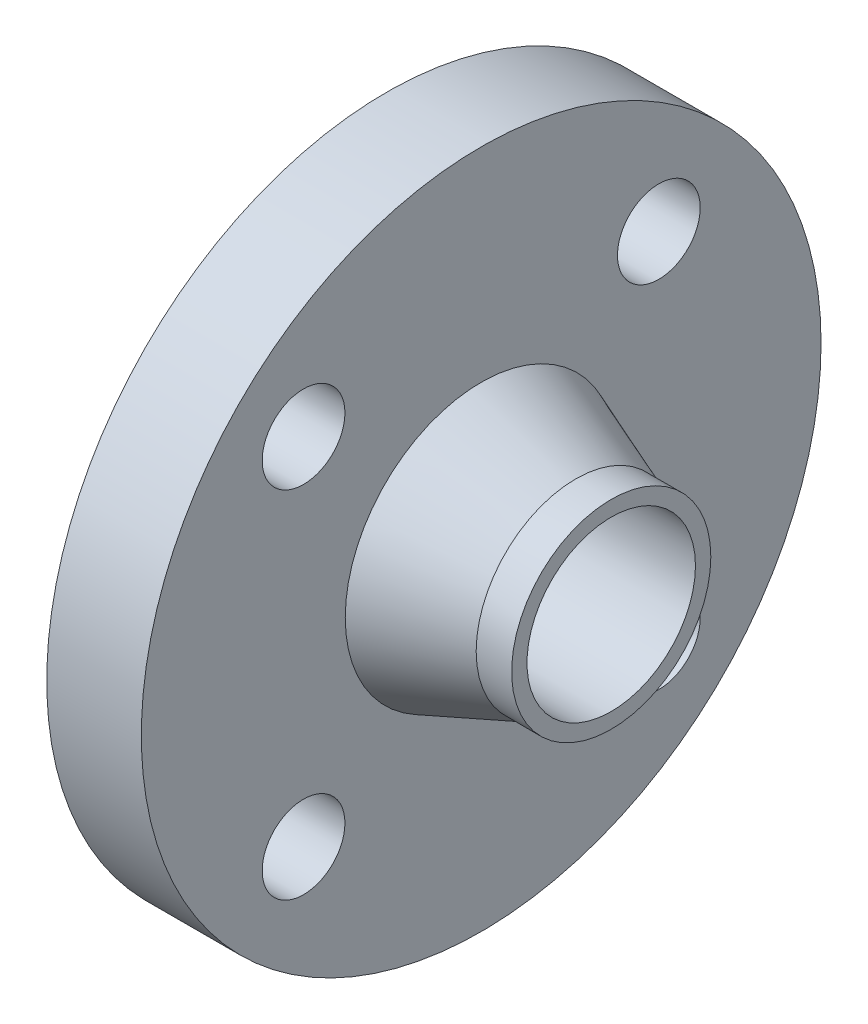
ISO-10303-21;
HEADER;
FILE_DESCRIPTION(('STEP AP214'),'2;1');
FILE_NAME('part.step','',(''),(''),'','','');
FILE_SCHEMA(('AUTOMOTIVE_DESIGN { 1 0 10303 214 1 1 1 1 }'));
ENDSEC;
DATA;
#1=APPLICATION_CONTEXT('core data for automotive mechanical design processes');
#2=APPLICATION_PROTOCOL_DEFINITION('international standard','automotive_design',2000,#1);
#3=PRODUCT_CONTEXT('',#1,'mechanical');
#4=PRODUCT('Part','Part','',(#3));
#5=PRODUCT_RELATED_PRODUCT_CATEGORY('part','',(#4));
#6=PRODUCT_DEFINITION_FORMATION('','',#4);
#7=PRODUCT_DEFINITION_CONTEXT('part definition',#1,'design');
#8=PRODUCT_DEFINITION('design','',#6,#7);
#9=PRODUCT_DEFINITION_SHAPE('','',#8);
#10=(LENGTH_UNIT() NAMED_UNIT(*) SI_UNIT(.MILLI.,.METRE.));
#11=(NAMED_UNIT(*) PLANE_ANGLE_UNIT() SI_UNIT($,.RADIAN.));
#12=(NAMED_UNIT(*) SI_UNIT($,.STERADIAN.) SOLID_ANGLE_UNIT());
#13=UNCERTAINTY_MEASURE_WITH_UNIT(LENGTH_MEASURE(1.E-05),#10,'distance_accuracy_value','');
#14=(GEOMETRIC_REPRESENTATION_CONTEXT(3) GLOBAL_UNCERTAINTY_ASSIGNED_CONTEXT((#13)) GLOBAL_UNIT_ASSIGNED_CONTEXT((#10,
#11,#12)) REPRESENTATION_CONTEXT('',''));
#15=CARTESIAN_POINT('',(0.,0.,0.));
#16=DIRECTION('',(0.,0.,1.));
#17=DIRECTION('',(1.,0.,0.));
#18=AXIS2_PLACEMENT_3D('',#15,#16,#17);
#19=CARTESIAN_POINT('',(0.,24.125,0.));
#20=DIRECTION('',(-1.,0.,0.));
#21=DIRECTION('',(0.,0.,1.));
#22=AXIS2_PLACEMENT_3D('',#19,#20,#21);
#23=PLANE('',#22);
#24=CARTESIAN_POINT('',(0.,0.,0.));
#25=DIRECTION('',(1.,0.,0.));
#26=DIRECTION('',(0.,0.,-1.));
#27=AXIS2_PLACEMENT_3D('',#24,#25,#26);
#28=CIRCLE('',#27,14.25);
#29=CARTESIAN_POINT('',(0.,0.,-14.25));
#30=VERTEX_POINT('',#29);
#31=EDGE_CURVE('E17',#30,#30,#28,.T.);
#32=ORIENTED_EDGE('',*,*,#31,.T.);
#33=EDGE_LOOP('',(#32));
#34=FACE_BOUND('',#33,.T.);
#35=CARTESIAN_POINT('',(0.,0.,0.));
#36=DIRECTION('',(1.,0.,0.));
#37=DIRECTION('',(0.,0.,-1.));
#38=AXIS2_PLACEMENT_3D('',#35,#36,#37);
#39=CIRCLE('',#38,34.);
#40=CARTESIAN_POINT('',(0.,0.,-34.));
#41=VERTEX_POINT('',#40);
#42=EDGE_CURVE('E67',#41,#41,#39,.T.);
#43=ORIENTED_EDGE('',*,*,#42,.F.);
#44=EDGE_LOOP('',(#43));
#45=FACE_BOUND('',#44,.T.);
#46=ADVANCED_FACE('F14',(#34,#45),#23,.T.);
#47=CARTESIAN_POINT('',(20.,0.,0.));
#48=DIRECTION('',(1.,0.,0.));
#49=DIRECTION('',(0.,0.,-1.));
#50=AXIS2_PLACEMENT_3D('',#47,#48,#49);
#51=CYLINDRICAL_SURFACE('',#50,14.25);
#52=CARTESIAN_POINT('',(40.,0.,0.));
#53=DIRECTION('',(1.,0.,0.));
#54=DIRECTION('',(0.,0.,-1.));
#55=AXIS2_PLACEMENT_3D('',#52,#53,#54);
#56=CIRCLE('',#55,14.25);
#57=CARTESIAN_POINT('',(40.,0.,-14.25));
#58=VERTEX_POINT('',#57);
#59=EDGE_CURVE('E65',#58,#58,#56,.F.);
#60=ORIENTED_EDGE('',*,*,#59,.F.);
#61=EDGE_LOOP('',(#60));
#62=FACE_BOUND('',#61,.T.);
#63=ORIENTED_EDGE('',*,*,#31,.F.);
#64=EDGE_LOOP('',(#63));
#65=FACE_BOUND('',#64,.T.);
#66=ADVANCED_FACE('F76',(#62,#65),#51,.F.);
#67=CARTESIAN_POINT('',(0.999999999999992,0.,0.));
#68=DIRECTION('',(1.,0.,0.));
#69=DIRECTION('',(0.,0.,-1.));
#70=AXIS2_PLACEMENT_3D('',#67,#68,#69);
#71=CYLINDRICAL_SURFACE('',#70,34.);
#72=ORIENTED_EDGE('',*,*,#42,.T.);
#73=EDGE_LOOP('',(#72));
#74=FACE_BOUND('',#73,.T.);
#75=CARTESIAN_POINT('',(1.99999999999999,0.,0.));
#76=DIRECTION('',(1.,0.,0.));
#77=DIRECTION('',(0.,0.,-1.));
#78=AXIS2_PLACEMENT_3D('',#75,#76,#77);
#79=CIRCLE('',#78,34.);
#80=CARTESIAN_POINT('',(1.99999999999999,0.,-34.));
#81=VERTEX_POINT('',#80);
#82=EDGE_CURVE('E62',#81,#81,#79,.T.);
#83=ORIENTED_EDGE('',*,*,#82,.F.);
#84=EDGE_LOOP('',(#83));
#85=FACE_BOUND('',#84,.T.);
#86=ADVANCED_FACE('F78',(#74,#85),#71,.T.);
#87=CARTESIAN_POINT('',(40.,15.55,0.));
#88=DIRECTION('',(1.,0.,0.));
#89=DIRECTION('',(0.,0.,-1.));
#90=AXIS2_PLACEMENT_3D('',#87,#88,#89);
#91=PLANE('',#90);
#92=ORIENTED_EDGE('',*,*,#59,.T.);
#93=EDGE_LOOP('',(#92));
#94=FACE_BOUND('',#93,.T.);
#95=CARTESIAN_POINT('',(40.,0.,0.));
#96=DIRECTION('',(1.,0.,0.));
#97=DIRECTION('',(0.,0.,-1.));
#98=AXIS2_PLACEMENT_3D('',#95,#96,#97);
#99=CIRCLE('',#98,16.85);
#100=CARTESIAN_POINT('',(40.,0.,-16.85));
#101=VERTEX_POINT('',#100);
#102=EDGE_CURVE('E59',#101,#101,#99,.F.);
#103=ORIENTED_EDGE('',*,*,#102,.F.);
#104=EDGE_LOOP('',(#103));
#105=FACE_BOUND('',#104,.T.);
#106=ADVANCED_FACE('F85',(#94,#105),#91,.T.);
#107=CARTESIAN_POINT('',(1.99999999999999,45.75,0.));
#108=DIRECTION('',(-1.,0.,0.));
#109=DIRECTION('',(0.,0.,1.));
#110=AXIS2_PLACEMENT_3D('',#107,#108,#109);
#111=PLANE('',#110);
#112=ORIENTED_EDGE('',*,*,#82,.T.);
#113=EDGE_LOOP('',(#112));
#114=FACE_BOUND('',#113,.T.);
#115=CARTESIAN_POINT('',(1.99999999999999,30.0520382004283,30.0520382004283));
#116=DIRECTION('',(1.,0.,0.));
#117=DIRECTION('',(0.,0.,-1.));
#118=AXIS2_PLACEMENT_3D('',#115,#116,#117);
#119=CIRCLE('',#118,7.);
#120=CARTESIAN_POINT('',(1.99999999999999,30.0520382004283,23.0520382004283));
#121=VERTEX_POINT('',#120);
#122=EDGE_CURVE('E44',#121,#121,#119,.T.);
#123=ORIENTED_EDGE('',*,*,#122,.T.);
#124=EDGE_LOOP('',(#123));
#125=FACE_BOUND('',#124,.T.);
#126=CARTESIAN_POINT('',(1.99999999999999,-30.0520382004283,30.0520382004283));
#127=DIRECTION('',(1.,0.,0.));
#128=DIRECTION('',(0.,0.,-1.));
#129=AXIS2_PLACEMENT_3D('',#126,#127,#128);
#130=CIRCLE('',#129,7.);
#131=CARTESIAN_POINT('',(1.99999999999999,-30.0520382004283,23.0520382004283));
#132=VERTEX_POINT('',#131);
#133=EDGE_CURVE('E47',#132,#132,#130,.T.);
#134=ORIENTED_EDGE('',*,*,#133,.T.);
#135=EDGE_LOOP('',(#134));
#136=FACE_BOUND('',#135,.T.);
#137=CARTESIAN_POINT('',(1.99999999999999,-30.0520382004283,-30.0520382004283));
#138=DIRECTION('',(1.,0.,0.));
#139=DIRECTION('',(0.,0.,-1.));
#140=AXIS2_PLACEMENT_3D('',#137,#138,#139);
#141=CIRCLE('',#140,7.);
#142=CARTESIAN_POINT('',(1.99999999999999,-30.0520382004283,-37.0520382004283));
#143=VERTEX_POINT('',#142);
#144=EDGE_CURVE('E50',#143,#143,#141,.T.);
#145=ORIENTED_EDGE('',*,*,#144,.T.);
#146=EDGE_LOOP('',(#145));
#147=FACE_BOUND('',#146,.T.);
#148=CARTESIAN_POINT('',(1.99999999999999,30.0520382004283,-30.0520382004283));
#149=DIRECTION('',(1.,0.,0.));
#150=DIRECTION('',(0.,0.,-1.));
#151=AXIS2_PLACEMENT_3D('',#148,#149,#150);
#152=CIRCLE('',#151,7.);
#153=CARTESIAN_POINT('',(1.99999999999999,30.0520382004283,-37.0520382004283));
#154=VERTEX_POINT('',#153);
#155=EDGE_CURVE('E53',#154,#154,#152,.T.);
#156=ORIENTED_EDGE('',*,*,#155,.T.);
#157=EDGE_LOOP('',(#156));
#158=FACE_BOUND('',#157,.T.);
#159=CARTESIAN_POINT('',(1.99999999999998,0.,0.));
#160=DIRECTION('',(1.,0.,0.));
#161=DIRECTION('',(0.,0.,-1.));
#162=AXIS2_PLACEMENT_3D('',#159,#160,#161);
#163=CIRCLE('',#162,57.5);
#164=CARTESIAN_POINT('',(1.99999999999998,0.,-57.5));
#165=VERTEX_POINT('',#164);
#166=EDGE_CURVE('E56',#165,#165,#163,.T.);
#167=ORIENTED_EDGE('',*,*,#166,.F.);
#168=EDGE_LOOP('',(#167));
#169=FACE_BOUND('',#168,.T.);
#170=ADVANCED_FACE('F122',(#114,#125,#136,#147,#158,#169),#111,.T.);
#171=CARTESIAN_POINT('',(37.,0.,0.));
#172=DIRECTION('',(1.,0.,0.));
#173=DIRECTION('',(0.,0.,-1.));
#174=AXIS2_PLACEMENT_3D('',#171,#172,#173);
#175=CYLINDRICAL_SURFACE('',#174,16.85);
#176=CARTESIAN_POINT('',(34.0000000012894,0.,0.));
#177=DIRECTION('',(-1.,0.,0.));
#178=DIRECTION('',(0.,1.,0.));
#179=AXIS2_PLACEMENT_3D('',#176,#177,#178);
#180=CIRCLE('',#179,16.8500000033545);
#181=CARTESIAN_POINT('',(34.0000000012894,16.8500000033545,0.));
#182=VERTEX_POINT('',#181);
#183=EDGE_CURVE('E43',#182,#182,#180,.T.);
#184=ORIENTED_EDGE('',*,*,#183,.F.);
#185=EDGE_LOOP('',(#184));
#186=FACE_BOUND('',#185,.T.);
#187=ORIENTED_EDGE('',*,*,#102,.T.);
#188=EDGE_LOOP('',(#187));
#189=FACE_BOUND('',#188,.T.);
#190=ADVANCED_FACE('F118',(#186,#189),#175,.T.);
#191=CARTESIAN_POINT('',(9.99999999999998,0.,0.));
#192=DIRECTION('',(1.,0.,0.));
#193=DIRECTION('',(0.,0.,-1.));
#194=AXIS2_PLACEMENT_3D('',#191,#192,#193);
#195=CYLINDRICAL_SURFACE('',#194,57.5);
#196=ORIENTED_EDGE('',*,*,#166,.T.);
#197=EDGE_LOOP('',(#196));
#198=FACE_BOUND('',#197,.T.);
#199=CARTESIAN_POINT('',(18.,0.,0.));
#200=DIRECTION('',(1.,0.,0.));
#201=DIRECTION('',(0.,0.,-1.));
#202=AXIS2_PLACEMENT_3D('',#199,#200,#201);
#203=CIRCLE('',#202,57.5);
#204=CARTESIAN_POINT('',(18.,0.,-57.5));
#205=VERTEX_POINT('',#204);
#206=EDGE_CURVE('E40',#205,#205,#203,.T.);
#207=ORIENTED_EDGE('',*,*,#206,.F.);
#208=EDGE_LOOP('',(#207));
#209=FACE_BOUND('',#208,.T.);
#210=ADVANCED_FACE('F114',(#198,#209),#195,.T.);
#211=CARTESIAN_POINT('',(1.99999999999999,30.0520382004283,-30.0520382004283));
#212=DIRECTION('',(1.,0.,0.));
#213=DIRECTION('',(0.,0.,-1.));
#214=AXIS2_PLACEMENT_3D('',#211,#212,#213);
#215=CYLINDRICAL_SURFACE('',#214,7.);
#216=ORIENTED_EDGE('',*,*,#155,.F.);
#217=EDGE_LOOP('',(#216));
#218=FACE_BOUND('',#217,.T.);
#219=CARTESIAN_POINT('',(18.,30.0520382004283,-30.0520382004283));
#220=DIRECTION('',(1.,0.,0.));
#221=DIRECTION('',(0.,0.,-1.));
#222=AXIS2_PLACEMENT_3D('',#219,#220,#221);
#223=CIRCLE('',#222,7.);
#224=CARTESIAN_POINT('',(18.,30.0520382004283,-37.0520382004283));
#225=VERTEX_POINT('',#224);
#226=EDGE_CURVE('E37',#225,#225,#223,.F.);
#227=ORIENTED_EDGE('',*,*,#226,.F.);
#228=EDGE_LOOP('',(#227));
#229=FACE_BOUND('',#228,.T.);
#230=ADVANCED_FACE('F110',(#218,#229),#215,.F.);
#231=CARTESIAN_POINT('',(1.99999999999999,-30.0520382004283,-30.0520382004283));
#232=DIRECTION('',(1.,0.,0.));
#233=DIRECTION('',(0.,0.,-1.));
#234=AXIS2_PLACEMENT_3D('',#231,#232,#233);
#235=CYLINDRICAL_SURFACE('',#234,7.);
#236=ORIENTED_EDGE('',*,*,#144,.F.);
#237=EDGE_LOOP('',(#236));
#238=FACE_BOUND('',#237,.T.);
#239=CARTESIAN_POINT('',(18.,-30.0520382004283,-30.0520382004283));
#240=DIRECTION('',(1.,0.,0.));
#241=DIRECTION('',(0.,0.,-1.));
#242=AXIS2_PLACEMENT_3D('',#239,#240,#241);
#243=CIRCLE('',#242,7.);
#244=CARTESIAN_POINT('',(18.,-30.0520382004283,-37.0520382004283));
#245=VERTEX_POINT('',#244);
#246=EDGE_CURVE('E34',#245,#245,#243,.F.);
#247=ORIENTED_EDGE('',*,*,#246,.F.);
#248=EDGE_LOOP('',(#247));
#249=FACE_BOUND('',#248,.T.);
#250=ADVANCED_FACE('F106',(#238,#249),#235,.F.);
#251=CARTESIAN_POINT('',(1.99999999999999,-30.0520382004283,30.0520382004283));
#252=DIRECTION('',(1.,0.,0.));
#253=DIRECTION('',(0.,0.,-1.));
#254=AXIS2_PLACEMENT_3D('',#251,#252,#253);
#255=CYLINDRICAL_SURFACE('',#254,7.);
#256=ORIENTED_EDGE('',*,*,#133,.F.);
#257=EDGE_LOOP('',(#256));
#258=FACE_BOUND('',#257,.T.);
#259=CARTESIAN_POINT('',(18.,-30.0520382004283,30.0520382004283));
#260=DIRECTION('',(1.,0.,0.));
#261=DIRECTION('',(0.,0.,-1.));
#262=AXIS2_PLACEMENT_3D('',#259,#260,#261);
#263=CIRCLE('',#262,7.);
#264=CARTESIAN_POINT('',(18.,-30.0520382004283,23.0520382004283));
#265=VERTEX_POINT('',#264);
#266=EDGE_CURVE('E26',#265,#265,#263,.F.);
#267=ORIENTED_EDGE('',*,*,#266,.F.);
#268=EDGE_LOOP('',(#267));
#269=FACE_BOUND('',#268,.T.);
#270=ADVANCED_FACE('F102',(#258,#269),#255,.F.);
#271=CARTESIAN_POINT('',(1.99999999999999,30.0520382004283,30.0520382004283));
#272=DIRECTION('',(1.,0.,0.));
#273=DIRECTION('',(0.,0.,-1.));
#274=AXIS2_PLACEMENT_3D('',#271,#272,#273);
#275=CYLINDRICAL_SURFACE('',#274,7.);
#276=ORIENTED_EDGE('',*,*,#122,.F.);
#277=EDGE_LOOP('',(#276));
#278=FACE_BOUND('',#277,.T.);
#279=CARTESIAN_POINT('',(18.,30.0520382004283,30.0520382004283));
#280=DIRECTION('',(1.,0.,0.));
#281=DIRECTION('',(0.,0.,-1.));
#282=AXIS2_PLACEMENT_3D('',#279,#280,#281);
#283=CIRCLE('',#282,7.);
#284=CARTESIAN_POINT('',(18.,30.0520382004283,23.0520382004283));
#285=VERTEX_POINT('',#284);
#286=EDGE_CURVE('E21',#285,#285,#283,.F.);
#287=ORIENTED_EDGE('',*,*,#286,.F.);
#288=EDGE_LOOP('',(#287));
#289=FACE_BOUND('',#288,.T.);
#290=ADVANCED_FACE('F95',(#278,#289),#275,.F.);
#291=CARTESIAN_POINT('',(17.9999999987106,0.,0.));
#292=DIRECTION('',(-1.,0.,0.));
#293=DIRECTION('',(0.,0.,1.));
#294=AXIS2_PLACEMENT_3D('',#291,#292,#293);
#295=CONICAL_SURFACE('',#294,22.9999999966455,0.366964409318193);
#296=CARTESIAN_POINT('',(17.9999999987106,0.,0.));
#297=DIRECTION('',(-1.,0.,0.));
#298=DIRECTION('',(0.,0.,1.));
#299=AXIS2_PLACEMENT_3D('',#296,#297,#298);
#300=CIRCLE('',#299,22.9999999966455);
#301=CARTESIAN_POINT('',(17.9999999987106,0.,22.9999999966455));
#302=VERTEX_POINT('',#301);
#303=EDGE_CURVE('E9',#302,#302,#300,.T.);
#304=ORIENTED_EDGE('',*,*,#303,.F.);
#305=EDGE_LOOP('',(#304));
#306=FACE_BOUND('',#305,.T.);
#307=ORIENTED_EDGE('',*,*,#183,.T.);
#308=EDGE_LOOP('',(#307));
#309=FACE_BOUND('',#308,.T.);
#310=ADVANCED_FACE('F90',(#306,#309),#295,.T.);
#311=CARTESIAN_POINT('',(18.,40.25,0.));
#312=DIRECTION('',(1.,0.,0.));
#313=DIRECTION('',(0.,0.,-1.));
#314=AXIS2_PLACEMENT_3D('',#311,#312,#313);
#315=PLANE('',#314);
#316=ORIENTED_EDGE('',*,*,#303,.T.);
#317=EDGE_LOOP('',(#316));
#318=FACE_BOUND('',#317,.T.);
#319=ORIENTED_EDGE('',*,*,#286,.T.);
#320=EDGE_LOOP('',(#319));
#321=FACE_BOUND('',#320,.T.);
#322=ORIENTED_EDGE('',*,*,#266,.T.);
#323=EDGE_LOOP('',(#322));
#324=FACE_BOUND('',#323,.T.);
#325=ORIENTED_EDGE('',*,*,#246,.T.);
#326=EDGE_LOOP('',(#325));
#327=FACE_BOUND('',#326,.T.);
#328=ORIENTED_EDGE('',*,*,#226,.T.);
#329=EDGE_LOOP('',(#328));
#330=FACE_BOUND('',#329,.T.);
#331=ORIENTED_EDGE('',*,*,#206,.T.);
#332=EDGE_LOOP('',(#331));
#333=FACE_BOUND('',#332,.T.);
#334=ADVANCED_FACE('F88',(#318,#321,#324,#327,#330,#333),#315,.T.);
#335=CLOSED_SHELL('',(#46,#66,#86,#106,#170,#190,#210,#230,#250,#270,#290,#310,#334));
#336=MANIFOLD_SOLID_BREP('B1',#335);
#337=ADVANCED_BREP_SHAPE_REPRESENTATION('',(#18,#336),#14);
#338=SHAPE_DEFINITION_REPRESENTATION(#9,#337);
ENDSEC;
END-ISO-10303-21;
